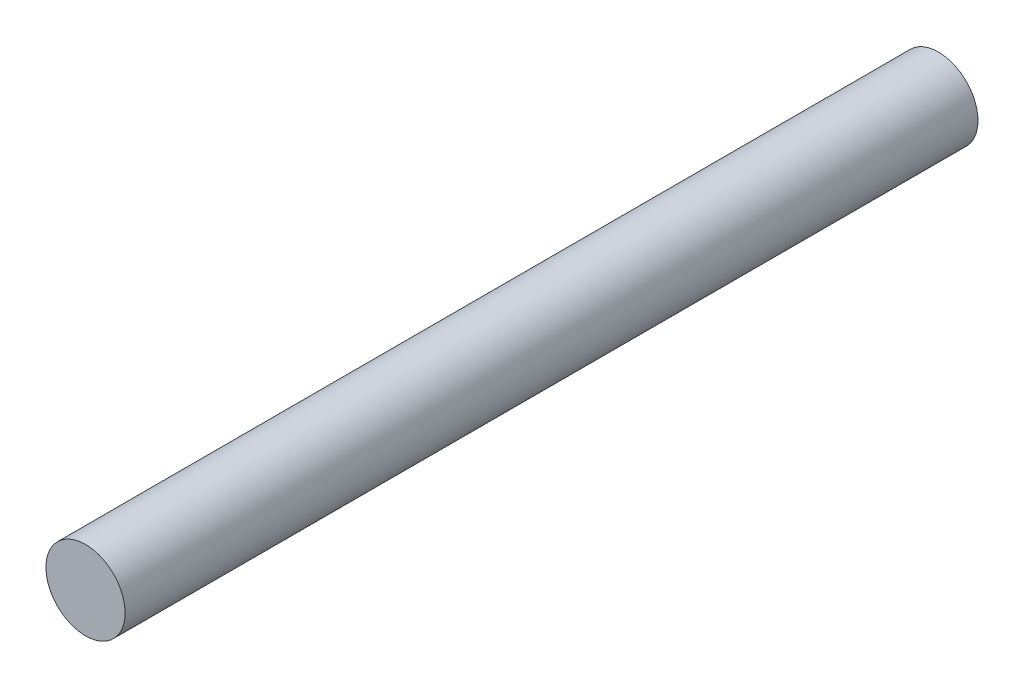
ISO-10303-21;
HEADER;
FILE_DESCRIPTION(('STEP AP214'),'2;1');
FILE_NAME('part.step','',(''),(''),'','','');
FILE_SCHEMA(('AUTOMOTIVE_DESIGN { 1 0 10303 214 1 1 1 1 }'));
ENDSEC;
DATA;
#1=APPLICATION_CONTEXT('core data for automotive mechanical design processes');
#2=APPLICATION_PROTOCOL_DEFINITION('international standard','automotive_design',2000,#1);
#3=PRODUCT_CONTEXT('',#1,'mechanical');
#4=PRODUCT('Part','Part','',(#3));
#5=PRODUCT_RELATED_PRODUCT_CATEGORY('part','',(#4));
#6=PRODUCT_DEFINITION_FORMATION('','',#4);
#7=PRODUCT_DEFINITION_CONTEXT('part definition',#1,'design');
#8=PRODUCT_DEFINITION('design','',#6,#7);
#9=PRODUCT_DEFINITION_SHAPE('','',#8);
#10=(LENGTH_UNIT() NAMED_UNIT(*) SI_UNIT(.MILLI.,.METRE.));
#11=(NAMED_UNIT(*) PLANE_ANGLE_UNIT() SI_UNIT($,.RADIAN.));
#12=(NAMED_UNIT(*) SI_UNIT($,.STERADIAN.) SOLID_ANGLE_UNIT());
#13=UNCERTAINTY_MEASURE_WITH_UNIT(LENGTH_MEASURE(1.E-05),#10,'distance_accuracy_value','');
#14=(GEOMETRIC_REPRESENTATION_CONTEXT(3) GLOBAL_UNCERTAINTY_ASSIGNED_CONTEXT((#13)) GLOBAL_UNIT_ASSIGNED_CONTEXT((#10,
#11,#12)) REPRESENTATION_CONTEXT('',''));
#15=CARTESIAN_POINT('',(0.,0.,0.));
#16=DIRECTION('',(0.,0.,1.));
#17=DIRECTION('',(1.,0.,0.));
#18=AXIS2_PLACEMENT_3D('',#15,#16,#17);
#19=CARTESIAN_POINT('',(0.,0.,70.));
#20=DIRECTION('',(0.,0.,-1.));
#21=DIRECTION('',(-1.,0.,0.));
#22=AXIS2_PLACEMENT_3D('',#19,#20,#21);
#23=CYLINDRICAL_SURFACE('',#22,3.25);
#24=CARTESIAN_POINT('',(0.,0.,70.));
#25=DIRECTION('',(0.,0.,1.));
#26=DIRECTION('',(1.,0.,0.));
#27=AXIS2_PLACEMENT_3D('',#24,#25,#26);
#28=CIRCLE('',#27,3.25);
#29=CARTESIAN_POINT('',(3.25,0.,70.));
#30=VERTEX_POINT('',#29);
#31=EDGE_CURVE('E10',#30,#30,#28,.T.);
#32=ORIENTED_EDGE('',*,*,#31,.F.);
#33=EDGE_LOOP('',(#32));
#34=FACE_BOUND('',#33,.T.);
#35=CARTESIAN_POINT('',(0.,0.,0.));
#36=DIRECTION('',(0.,0.,1.));
#37=DIRECTION('',(1.,0.,0.));
#38=AXIS2_PLACEMENT_3D('',#35,#36,#37);
#39=CIRCLE('',#38,3.25);
#40=CARTESIAN_POINT('',(3.25,0.,0.));
#41=VERTEX_POINT('',#40);
#42=EDGE_CURVE('E34',#41,#41,#39,.T.);
#43=ORIENTED_EDGE('',*,*,#42,.T.);
#44=EDGE_LOOP('',(#43));
#45=FACE_BOUND('',#44,.T.);
#46=ADVANCED_FACE('F31',(#34,#45),#23,.T.);
#47=CARTESIAN_POINT('',(0.,0.,70.));
#48=DIRECTION('',(0.,0.,1.));
#49=DIRECTION('',(1.,0.,0.));
#50=AXIS2_PLACEMENT_3D('',#47,#48,#49);
#51=PLANE('',#50);
#52=ORIENTED_EDGE('',*,*,#31,.T.);
#53=EDGE_LOOP('',(#52));
#54=FACE_BOUND('',#53,.T.);
#55=ADVANCED_FACE('F46',(#54),#51,.T.);
#56=CARTESIAN_POINT('',(0.,0.,0.));
#57=DIRECTION('',(0.,0.,1.));
#58=DIRECTION('',(1.,0.,0.));
#59=AXIS2_PLACEMENT_3D('',#56,#57,#58);
#60=PLANE('',#59);
#61=ORIENTED_EDGE('',*,*,#42,.F.);
#62=EDGE_LOOP('',(#61));
#63=FACE_BOUND('',#62,.T.);
#64=ADVANCED_FACE('F44',(#63),#60,.F.);
#65=CLOSED_SHELL('',(#46,#55,#64));
#66=MANIFOLD_SOLID_BREP('B2',#65);
#67=ADVANCED_BREP_SHAPE_REPRESENTATION('',(#18,#66),#14);
#68=SHAPE_DEFINITION_REPRESENTATION(#9,#67);
ENDSEC;
END-ISO-10303-21;
